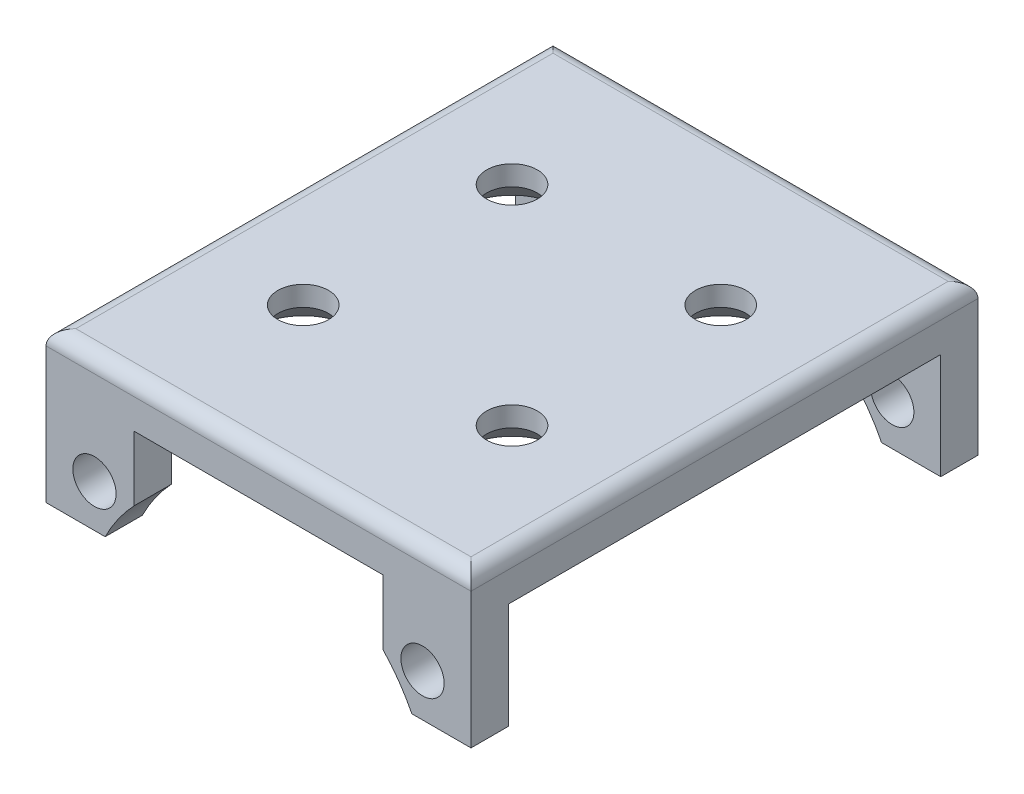
ISO-10303-21;
HEADER;
FILE_DESCRIPTION(('STEP AP214'),'2;1');
FILE_NAME('part.step','',(''),(''),'','','');
FILE_SCHEMA(('AUTOMOTIVE_DESIGN { 1 0 10303 214 1 1 1 1 }'));
ENDSEC;
DATA;
#1=APPLICATION_CONTEXT('core data for automotive mechanical design processes');
#2=APPLICATION_PROTOCOL_DEFINITION('international standard','automotive_design',2000,#1);
#3=PRODUCT_CONTEXT('',#1,'mechanical');
#4=PRODUCT('Part','Part','',(#3));
#5=PRODUCT_RELATED_PRODUCT_CATEGORY('part','',(#4));
#6=PRODUCT_DEFINITION_FORMATION('','',#4);
#7=PRODUCT_DEFINITION_CONTEXT('part definition',#1,'design');
#8=PRODUCT_DEFINITION('design','',#6,#7);
#9=PRODUCT_DEFINITION_SHAPE('','',#8);
#10=(LENGTH_UNIT() NAMED_UNIT(*) SI_UNIT(.MILLI.,.METRE.));
#11=(NAMED_UNIT(*) PLANE_ANGLE_UNIT() SI_UNIT($,.RADIAN.));
#12=(NAMED_UNIT(*) SI_UNIT($,.STERADIAN.) SOLID_ANGLE_UNIT());
#13=UNCERTAINTY_MEASURE_WITH_UNIT(LENGTH_MEASURE(1.E-05),#10,'distance_accuracy_value','');
#14=(GEOMETRIC_REPRESENTATION_CONTEXT(3) GLOBAL_UNCERTAINTY_ASSIGNED_CONTEXT((#13)) GLOBAL_UNIT_ASSIGNED_CONTEXT((#10,
#11,#12)) REPRESENTATION_CONTEXT('',''));
#15=CARTESIAN_POINT('',(0.,0.,0.));
#16=DIRECTION('',(0.,0.,1.));
#17=DIRECTION('',(1.,0.,0.));
#18=AXIS2_PLACEMENT_3D('',#15,#16,#17);
#19=CARTESIAN_POINT('',(0.,0.,-17.));
#20=DIRECTION('',(0.,0.,1.));
#21=DIRECTION('',(1.,0.,0.));
#22=AXIS2_PLACEMENT_3D('',#19,#20,#21);
#23=CYLINDRICAL_SURFACE('',#22,11.5);
#24=CARTESIAN_POINT('',(0.,0.,-17.));
#25=DIRECTION('',(0.,0.,1.));
#26=DIRECTION('',(1.,0.,0.));
#27=AXIS2_PLACEMENT_3D('',#24,#25,#26);
#28=CIRCLE('',#27,11.5);
#29=CARTESIAN_POINT('',(-8.35,7.90743321185831,-17.));
#30=VERTEX_POINT('',#29);
#31=CARTESIAN_POINT('',(-10.2823878549683,5.15,-17.));
#32=VERTEX_POINT('',#31);
#33=EDGE_CURVE('E212',#30,#32,#28,.T.);
#34=ORIENTED_EDGE('',*,*,#33,.F.);
#35=DIRECTION('',(0.,0.,1.));
#36=VECTOR('',#35,1.);
#37=CARTESIAN_POINT('',(-8.35,7.90743321185831,-17.));
#38=LINE('',#37,#36);
#39=CARTESIAN_POINT('',(-8.35,7.90743321185832,-14.5));
#40=VERTEX_POINT('',#39);
#41=EDGE_CURVE('E248',#30,#40,#38,.T.);
#42=ORIENTED_EDGE('',*,*,#41,.T.);
#43=CARTESIAN_POINT('',(0.,0.,-14.5));
#44=DIRECTION('',(0.,0.,-1.));
#45=DIRECTION('',(-1.,0.,0.));
#46=AXIS2_PLACEMENT_3D('',#43,#44,#45);
#47=CIRCLE('',#46,11.5);
#48=CARTESIAN_POINT('',(-10.2823878549683,5.15,-14.5));
#49=VERTEX_POINT('',#48);
#50=EDGE_CURVE('E322',#40,#49,#47,.F.);
#51=ORIENTED_EDGE('',*,*,#50,.T.);
#52=DIRECTION('',(0.,0.,1.));
#53=VECTOR('',#52,1.);
#54=CARTESIAN_POINT('',(-10.2823878549683,5.15,-17.));
#55=LINE('',#54,#53);
#56=EDGE_CURVE('E396',#49,#32,#55,.F.);
#57=ORIENTED_EDGE('',*,*,#56,.T.);
#58=EDGE_LOOP('',(#34,#42,#51,#57));
#59=FACE_BOUND('',#58,.T.);
#60=ADVANCED_FACE('F47',(#59),#23,.F.);
#61=CARTESIAN_POINT('',(-11.,8.,-17.));
#62=DIRECTION('',(0.,0.,1.));
#63=DIRECTION('',(1.,0.,0.));
#64=AXIS2_PLACEMENT_3D('',#61,#62,#63);
#65=CYLINDRICAL_SURFACE('',#64,1.45);
#66=CARTESIAN_POINT('',(-11.,8.,-14.5));
#67=DIRECTION('',(0.,0.,-1.));
#68=DIRECTION('',(-1.,0.,0.));
#69=AXIS2_PLACEMENT_3D('',#66,#67,#68);
#70=CIRCLE('',#69,1.45);
#71=CARTESIAN_POINT('',(-12.45,8.,-14.5));
#72=VERTEX_POINT('',#71);
#73=EDGE_CURVE('E318',#72,#72,#70,.F.);
#74=ORIENTED_EDGE('',*,*,#73,.T.);
#75=EDGE_LOOP('',(#74));
#76=FACE_BOUND('',#75,.T.);
#77=CARTESIAN_POINT('',(-11.,8.,-17.));
#78=DIRECTION('',(0.,0.,1.));
#79=DIRECTION('',(1.,0.,0.));
#80=AXIS2_PLACEMENT_3D('',#77,#78,#79);
#81=CIRCLE('',#80,1.45);
#82=CARTESIAN_POINT('',(-9.55000000000001,8.,-17.));
#83=VERTEX_POINT('',#82);
#84=EDGE_CURVE('E211',#83,#83,#81,.T.);
#85=ORIENTED_EDGE('',*,*,#84,.F.);
#86=EDGE_LOOP('',(#85));
#87=FACE_BOUND('',#86,.T.);
#88=ADVANCED_FACE('F591',(#76,#87),#65,.F.);
#89=CARTESIAN_POINT('',(0.,0.,-17.));
#90=DIRECTION('',(0.,0.,1.));
#91=DIRECTION('',(1.,0.,0.));
#92=AXIS2_PLACEMENT_3D('',#89,#90,#91);
#93=CYLINDRICAL_SURFACE('',#92,11.5);
#94=CARTESIAN_POINT('',(0.,0.,-14.5));
#95=DIRECTION('',(0.,0.,-1.));
#96=DIRECTION('',(-1.,0.,0.));
#97=AXIS2_PLACEMENT_3D('',#94,#95,#96);
#98=CIRCLE('',#97,11.5);
#99=CARTESIAN_POINT('',(10.2823878549683,5.15,-14.5));
#100=VERTEX_POINT('',#99);
#101=CARTESIAN_POINT('',(8.35,7.90743321185832,-14.5));
#102=VERTEX_POINT('',#101);
#103=EDGE_CURVE('E314',#100,#102,#98,.F.);
#104=ORIENTED_EDGE('',*,*,#103,.T.);
#105=DIRECTION('',(0.,0.,1.));
#106=VECTOR('',#105,1.);
#107=CARTESIAN_POINT('',(8.35,7.90743321185831,-17.));
#108=LINE('',#107,#106);
#109=CARTESIAN_POINT('',(8.35,7.90743321185831,-17.));
#110=VERTEX_POINT('',#109);
#111=EDGE_CURVE('E71',#102,#110,#108,.F.);
#112=ORIENTED_EDGE('',*,*,#111,.T.);
#113=CARTESIAN_POINT('',(0.,0.,-17.));
#114=DIRECTION('',(0.,0.,1.));
#115=DIRECTION('',(1.,0.,0.));
#116=AXIS2_PLACEMENT_3D('',#113,#114,#115);
#117=CIRCLE('',#116,11.5);
#118=CARTESIAN_POINT('',(10.2823878549683,5.15,-17.));
#119=VERTEX_POINT('',#118);
#120=EDGE_CURVE('E224',#119,#110,#117,.T.);
#121=ORIENTED_EDGE('',*,*,#120,.F.);
#122=DIRECTION('',(0.,0.,1.));
#123=VECTOR('',#122,1.);
#124=CARTESIAN_POINT('',(10.2823878549683,5.15,-17.));
#125=LINE('',#124,#123);
#126=EDGE_CURVE('E400',#119,#100,#125,.T.);
#127=ORIENTED_EDGE('',*,*,#126,.T.);
#128=EDGE_LOOP('',(#104,#112,#121,#127));
#129=FACE_BOUND('',#128,.T.);
#130=ADVANCED_FACE('F573',(#129),#93,.F.);
#131=CARTESIAN_POINT('',(11.,8.00000000000031,-17.));
#132=DIRECTION('',(0.,0.,1.));
#133=DIRECTION('',(1.,0.,0.));
#134=AXIS2_PLACEMENT_3D('',#131,#132,#133);
#135=CYLINDRICAL_SURFACE('',#134,1.45);
#136=CARTESIAN_POINT('',(11.,8.00000000000031,-14.5));
#137=DIRECTION('',(0.,0.,-1.));
#138=DIRECTION('',(-1.,0.,0.));
#139=AXIS2_PLACEMENT_3D('',#136,#137,#138);
#140=CIRCLE('',#139,1.45);
#141=CARTESIAN_POINT('',(9.54999999999999,8.00000000000031,-14.5));
#142=VERTEX_POINT('',#141);
#143=EDGE_CURVE('E310',#142,#142,#140,.F.);
#144=ORIENTED_EDGE('',*,*,#143,.T.);
#145=EDGE_LOOP('',(#144));
#146=FACE_BOUND('',#145,.T.);
#147=CARTESIAN_POINT('',(11.,8.00000000000031,-17.));
#148=DIRECTION('',(0.,0.,1.));
#149=DIRECTION('',(1.,0.,0.));
#150=AXIS2_PLACEMENT_3D('',#147,#148,#149);
#151=CIRCLE('',#150,1.45);
#152=CARTESIAN_POINT('',(12.45,8.00000000000031,-17.));
#153=VERTEX_POINT('',#152);
#154=EDGE_CURVE('E453',#153,#153,#151,.T.);
#155=ORIENTED_EDGE('',*,*,#154,.F.);
#156=EDGE_LOOP('',(#155));
#157=FACE_BOUND('',#156,.T.);
#158=ADVANCED_FACE('F611',(#146,#157),#135,.F.);
#159=CARTESIAN_POINT('',(0.,12.25,-17.));
#160=DIRECTION('',(0.,-1.,0.));
#161=DIRECTION('',(0.,0.,-1.));
#162=AXIS2_PLACEMENT_3D('',#159,#160,#161);
#163=PLANE('',#162);
#164=DIRECTION('',(0.,0.,1.));
#165=VECTOR('',#164,1.);
#166=CARTESIAN_POINT('',(8.35,12.25,-17.));
#167=LINE('',#166,#165);
#168=CARTESIAN_POINT('',(8.35,12.25,14.5));
#169=VERTEX_POINT('',#168);
#170=CARTESIAN_POINT('',(8.35,12.25,17.));
#171=VERTEX_POINT('',#170);
#172=EDGE_CURVE('E63',#169,#171,#167,.T.);
#173=ORIENTED_EDGE('',*,*,#172,.T.);
#174=DIRECTION('',(1.,0.,0.));
#175=VECTOR('',#174,1.);
#176=CARTESIAN_POINT('',(0.,12.25,17.));
#177=LINE('',#176,#175);
#178=CARTESIAN_POINT('',(-8.35,12.25,17.));
#179=VERTEX_POINT('',#178);
#180=EDGE_CURVE('E429',#179,#171,#177,.T.);
#181=ORIENTED_EDGE('',*,*,#180,.F.);
#182=DIRECTION('',(0.,0.,1.));
#183=VECTOR('',#182,1.);
#184=CARTESIAN_POINT('',(-8.35,12.25,-17.));
#185=LINE('',#184,#183);
#186=CARTESIAN_POINT('',(-8.35,12.25,14.5));
#187=VERTEX_POINT('',#186);
#188=EDGE_CURVE('E217',#187,#179,#185,.T.);
#189=ORIENTED_EDGE('',*,*,#188,.F.);
#190=DIRECTION('',(-1.,0.,0.));
#191=VECTOR('',#190,1.);
#192=CARTESIAN_POINT('',(14.25,12.25,14.5));
#193=LINE('',#192,#191);
#194=CARTESIAN_POINT('',(-14.25,12.25,14.5));
#195=VERTEX_POINT('',#194);
#196=EDGE_CURVE('E286',#187,#195,#193,.T.);
#197=ORIENTED_EDGE('',*,*,#196,.T.);
#198=DIRECTION('',(0.,0.,-1.));
#199=VECTOR('',#198,1.);
#200=CARTESIAN_POINT('',(-14.25,12.25,-14.2));
#201=LINE('',#200,#199);
#202=CARTESIAN_POINT('',(-14.25,12.25,-14.5));
#203=VERTEX_POINT('',#202);
#204=EDGE_CURVE('E412',#195,#203,#201,.T.);
#205=ORIENTED_EDGE('',*,*,#204,.T.);
#206=DIRECTION('',(-1.,0.,0.));
#207=VECTOR('',#206,1.);
#208=CARTESIAN_POINT('',(14.25,12.25,-14.5));
#209=LINE('',#208,#207);
#210=CARTESIAN_POINT('',(-8.35,12.25,-14.5));
#211=VERTEX_POINT('',#210);
#212=EDGE_CURVE('E281',#211,#203,#209,.T.);
#213=ORIENTED_EDGE('',*,*,#212,.F.);
#214=CARTESIAN_POINT('',(-8.35,12.25,-17.));
#215=VERTEX_POINT('',#214);
#216=EDGE_CURVE('E205',#215,#211,#185,.T.);
#217=ORIENTED_EDGE('',*,*,#216,.F.);
#218=DIRECTION('',(1.,0.,0.));
#219=VECTOR('',#218,1.);
#220=CARTESIAN_POINT('',(0.,12.25,-17.));
#221=LINE('',#220,#219);
#222=CARTESIAN_POINT('',(8.35,12.25,-17.));
#223=VERTEX_POINT('',#222);
#224=EDGE_CURVE('E197',#215,#223,#221,.T.);
#225=ORIENTED_EDGE('',*,*,#224,.T.);
#226=CARTESIAN_POINT('',(8.35,12.25,-14.5));
#227=VERTEX_POINT('',#226);
#228=EDGE_CURVE('E202',#223,#227,#167,.T.);
#229=ORIENTED_EDGE('',*,*,#228,.T.);
#230=CARTESIAN_POINT('',(14.25,12.25,-14.5));
#231=VERTEX_POINT('',#230);
#232=EDGE_CURVE('E277',#231,#227,#209,.T.);
#233=ORIENTED_EDGE('',*,*,#232,.F.);
#234=DIRECTION('',(0.,0.,-1.));
#235=VECTOR('',#234,1.);
#236=CARTESIAN_POINT('',(14.25,12.25,-14.2));
#237=LINE('',#236,#235);
#238=CARTESIAN_POINT('',(14.25,12.25,14.5));
#239=VERTEX_POINT('',#238);
#240=EDGE_CURVE('E408',#239,#231,#237,.T.);
#241=ORIENTED_EDGE('',*,*,#240,.F.);
#242=EDGE_CURVE('E282',#239,#169,#193,.T.);
#243=ORIENTED_EDGE('',*,*,#242,.T.);
#244=EDGE_LOOP('',(#173,#181,#189,#197,#205,#213,#217,#225,#229,#233,#241,#243));
#245=FACE_BOUND('',#244,.T.);
#246=CARTESIAN_POINT('',(-7.,12.25,7.));
#247=DIRECTION('',(0.,-1.,0.));
#248=DIRECTION('',(0.,0.,-1.));
#249=AXIS2_PLACEMENT_3D('',#246,#247,#248);
#250=CIRCLE('',#249,3.36);
#251=CARTESIAN_POINT('',(-7.,12.25,3.64));
#252=VERTEX_POINT('',#251);
#253=EDGE_CURVE('E325',#252,#252,#250,.T.);
#254=ORIENTED_EDGE('',*,*,#253,.F.);
#255=EDGE_LOOP('',(#254));
#256=FACE_BOUND('',#255,.T.);
#257=CARTESIAN_POINT('',(-6.99999999999985,12.25,-7.));
#258=DIRECTION('',(0.,-1.,0.));
#259=DIRECTION('',(0.,0.,-1.));
#260=AXIS2_PLACEMENT_3D('',#257,#258,#259);
#261=CIRCLE('',#260,3.36);
#262=CARTESIAN_POINT('',(-6.99999999999985,12.25,-10.36));
#263=VERTEX_POINT('',#262);
#264=EDGE_CURVE('E337',#263,#263,#261,.T.);
#265=ORIENTED_EDGE('',*,*,#264,.F.);
#266=EDGE_LOOP('',(#265));
#267=FACE_BOUND('',#266,.T.);
#268=CARTESIAN_POINT('',(7.00000000000015,12.25,-7.));
#269=DIRECTION('',(0.,-1.,0.));
#270=DIRECTION('',(0.,0.,-1.));
#271=AXIS2_PLACEMENT_3D('',#268,#269,#270);
#272=CIRCLE('',#271,3.36);
#273=CARTESIAN_POINT('',(7.00000000000015,12.25,-10.36));
#274=VERTEX_POINT('',#273);
#275=EDGE_CURVE('E349',#274,#274,#272,.T.);
#276=ORIENTED_EDGE('',*,*,#275,.F.);
#277=EDGE_LOOP('',(#276));
#278=FACE_BOUND('',#277,.T.);
#279=CARTESIAN_POINT('',(7.,12.25,7.));
#280=DIRECTION('',(0.,-1.,0.));
#281=DIRECTION('',(0.,0.,-1.));
#282=AXIS2_PLACEMENT_3D('',#279,#280,#281);
#283=CIRCLE('',#282,3.36);
#284=CARTESIAN_POINT('',(7.,12.25,3.64));
#285=VERTEX_POINT('',#284);
#286=EDGE_CURVE('E361',#285,#285,#283,.T.);
#287=ORIENTED_EDGE('',*,*,#286,.F.);
#288=EDGE_LOOP('',(#287));
#289=FACE_BOUND('',#288,.T.);
#290=ADVANCED_FACE('F199',(#245,#256,#267,#278,#289),#163,.T.);
#291=CARTESIAN_POINT('',(0.,0.,14.5));
#292=DIRECTION('',(0.,0.,1.));
#293=DIRECTION('',(1.,0.,0.));
#294=AXIS2_PLACEMENT_3D('',#291,#292,#293);
#295=CIRCLE('',#294,11.5);
#296=CARTESIAN_POINT('',(-10.2823878549683,5.15,14.5));
#297=VERTEX_POINT('',#296);
#298=CARTESIAN_POINT('',(-8.35,7.90743321185832,14.5));
#299=VERTEX_POINT('',#298);
#300=EDGE_CURVE('E306',#297,#299,#295,.F.);
#301=ORIENTED_EDGE('',*,*,#300,.T.);
#302=DIRECTION('',(0.,0.,1.));
#303=VECTOR('',#302,1.);
#304=CARTESIAN_POINT('',(-8.35,7.90743321185831,-17.));
#305=LINE('',#304,#303);
#306=CARTESIAN_POINT('',(-8.35,7.90743321185831,17.));
#307=VERTEX_POINT('',#306);
#308=EDGE_CURVE('E239',#299,#307,#305,.T.);
#309=ORIENTED_EDGE('',*,*,#308,.T.);
#310=CARTESIAN_POINT('',(0.,0.,17.));
#311=DIRECTION('',(0.,0.,1.));
#312=DIRECTION('',(1.,0.,0.));
#313=AXIS2_PLACEMENT_3D('',#310,#311,#312);
#314=CIRCLE('',#313,11.5);
#315=CARTESIAN_POINT('',(-10.2823878549683,5.15,17.));
#316=VERTEX_POINT('',#315);
#317=EDGE_CURVE('E426',#307,#316,#314,.T.);
#318=ORIENTED_EDGE('',*,*,#317,.T.);
#319=DIRECTION('',(0.,0.,1.));
#320=VECTOR('',#319,1.);
#321=CARTESIAN_POINT('',(-10.2823878549683,5.15,-17.));
#322=LINE('',#321,#320);
#323=EDGE_CURVE('E387',#316,#297,#322,.F.);
#324=ORIENTED_EDGE('',*,*,#323,.T.);
#325=EDGE_LOOP('',(#301,#309,#318,#324));
#326=FACE_BOUND('',#325,.T.);
#327=ADVANCED_FACE('F509',(#326),#23,.F.);
#328=CARTESIAN_POINT('',(-14.25,0.,-17.));
#329=DIRECTION('',(1.,0.,0.));
#330=DIRECTION('',(0.,1.,0.));
#331=AXIS2_PLACEMENT_3D('',#328,#329,#330);
#332=PLANE('',#331);
#333=DIRECTION('',(0.,0.,1.));
#334=VECTOR('',#333,1.);
#335=CARTESIAN_POINT('',(-14.25,5.15,-17.));
#336=LINE('',#335,#334);
#337=CARTESIAN_POINT('',(-14.25,5.15,-17.));
#338=VERTEX_POINT('',#337);
#339=CARTESIAN_POINT('',(-14.25,5.15,-14.5));
#340=VERTEX_POINT('',#339);
#341=EDGE_CURVE('E383',#338,#340,#336,.T.);
#342=ORIENTED_EDGE('',*,*,#341,.T.);
#343=DIRECTION('',(0.,-1.,0.));
#344=VECTOR('',#343,1.);
#345=CARTESIAN_POINT('',(-14.25,5.15,-14.5));
#346=LINE('',#345,#344);
#347=EDGE_CURVE('E261',#203,#340,#346,.T.);
#348=ORIENTED_EDGE('',*,*,#347,.F.);
#349=ORIENTED_EDGE('',*,*,#204,.F.);
#350=DIRECTION('',(0.,1.,0.));
#351=VECTOR('',#350,1.);
#352=CARTESIAN_POINT('',(-14.25,5.15,14.5));
#353=LINE('',#352,#351);
#354=CARTESIAN_POINT('',(-14.25,5.15,14.5));
#355=VERTEX_POINT('',#354);
#356=EDGE_CURVE('E267',#355,#195,#353,.T.);
#357=ORIENTED_EDGE('',*,*,#356,.F.);
#358=CARTESIAN_POINT('',(-14.25,5.15,17.));
#359=VERTEX_POINT('',#358);
#360=EDGE_CURVE('E388',#355,#359,#336,.T.);
#361=ORIENTED_EDGE('',*,*,#360,.T.);
#362=DIRECTION('',(0.,1.,0.));
#363=VECTOR('',#362,1.);
#364=CARTESIAN_POINT('',(-14.25,0.,17.));
#365=LINE('',#364,#363);
#366=CARTESIAN_POINT('',(-14.25,14.25,17.));
#367=VERTEX_POINT('',#366);
#368=EDGE_CURVE('E423',#359,#367,#365,.T.);
#369=ORIENTED_EDGE('',*,*,#368,.T.);
#370=DIRECTION('',(0.,0.,1.));
#371=VECTOR('',#370,1.);
#372=CARTESIAN_POINT('',(-14.25,14.25,-17.));
#373=LINE('',#372,#371);
#374=CARTESIAN_POINT('',(-14.25,14.25,-17.));
#375=VERTEX_POINT('',#374);
#376=EDGE_CURVE('E474',#367,#375,#373,.F.);
#377=ORIENTED_EDGE('',*,*,#376,.T.);
#378=DIRECTION('',(0.,1.,0.));
#379=VECTOR('',#378,1.);
#380=CARTESIAN_POINT('',(-14.25,0.,-17.));
#381=LINE('',#380,#379);
#382=EDGE_CURVE('E445',#338,#375,#381,.T.);
#383=ORIENTED_EDGE('',*,*,#382,.F.);
#384=EDGE_LOOP('',(#342,#348,#349,#357,#361,#369,#377,#383));
#385=FACE_BOUND('',#384,.T.);
#386=ADVANCED_FACE('F554',(#385),#332,.F.);
#387=CARTESIAN_POINT('',(0.,15.25,-17.));
#388=DIRECTION('',(0.,1.,0.));
#389=DIRECTION('',(0.,0.,1.));
#390=AXIS2_PLACEMENT_3D('',#387,#388,#389);
#391=PLANE('',#390);
#392=CARTESIAN_POINT('',(-7.,15.25,7.));
#393=DIRECTION('',(0.,-1.,0.));
#394=DIRECTION('',(0.,0.,-1.));
#395=AXIS2_PLACEMENT_3D('',#392,#393,#394);
#396=CIRCLE('',#395,1.69999999999999);
#397=CARTESIAN_POINT('',(-7.,15.25,5.30000000000001));
#398=VERTEX_POINT('',#397);
#399=EDGE_CURVE('E333',#398,#398,#396,.T.);
#400=ORIENTED_EDGE('',*,*,#399,.T.);
#401=EDGE_LOOP('',(#400));
#402=FACE_BOUND('',#401,.T.);
#403=CARTESIAN_POINT('',(-6.99999999999985,15.25,-7.));
#404=DIRECTION('',(0.,-1.,0.));
#405=DIRECTION('',(0.,0.,-1.));
#406=AXIS2_PLACEMENT_3D('',#403,#404,#405);
#407=CIRCLE('',#406,1.69999999999999);
#408=CARTESIAN_POINT('',(-6.99999999999985,15.25,-8.69999999999999));
#409=VERTEX_POINT('',#408);
#410=EDGE_CURVE('E345',#409,#409,#407,.T.);
#411=ORIENTED_EDGE('',*,*,#410,.T.);
#412=EDGE_LOOP('',(#411));
#413=FACE_BOUND('',#412,.T.);
#414=CARTESIAN_POINT('',(7.00000000000015,15.25,-7.));
#415=DIRECTION('',(0.,-1.,0.));
#416=DIRECTION('',(0.,0.,-1.));
#417=AXIS2_PLACEMENT_3D('',#414,#415,#416);
#418=CIRCLE('',#417,1.69999999999999);
#419=CARTESIAN_POINT('',(7.00000000000015,15.25,-8.69999999999999));
#420=VERTEX_POINT('',#419);
#421=EDGE_CURVE('E357',#420,#420,#418,.T.);
#422=ORIENTED_EDGE('',*,*,#421,.T.);
#423=EDGE_LOOP('',(#422));
#424=FACE_BOUND('',#423,.T.);
#425=CARTESIAN_POINT('',(7.,15.25,7.));
#426=DIRECTION('',(0.,-1.,0.));
#427=DIRECTION('',(0.,0.,-1.));
#428=AXIS2_PLACEMENT_3D('',#425,#426,#427);
#429=CIRCLE('',#428,1.69999999999999);
#430=CARTESIAN_POINT('',(7.,15.25,5.30000000000001));
#431=VERTEX_POINT('',#430);
#432=EDGE_CURVE('E369',#431,#431,#429,.T.);
#433=ORIENTED_EDGE('',*,*,#432,.T.);
#434=EDGE_LOOP('',(#433));
#435=FACE_BOUND('',#434,.T.);
#436=DIRECTION('',(0.,0.,1.));
#437=VECTOR('',#436,1.);
#438=CARTESIAN_POINT('',(13.25,15.25,-17.));
#439=LINE('',#438,#437);
#440=CARTESIAN_POINT('',(13.25,15.25,16.));
#441=VERTEX_POINT('',#440);
#442=CARTESIAN_POINT('',(13.25,15.25,-16.));
#443=VERTEX_POINT('',#442);
#444=EDGE_CURVE('E467',#441,#443,#439,.F.);
#445=ORIENTED_EDGE('',*,*,#444,.T.);
#446=DIRECTION('',(-1.,0.,0.));
#447=VECTOR('',#446,1.);
#448=CARTESIAN_POINT('',(-14.25,15.25,-16.));
#449=LINE('',#448,#447);
#450=CARTESIAN_POINT('',(-13.25,15.25,-16.));
#451=VERTEX_POINT('',#450);
#452=EDGE_CURVE('E471',#443,#451,#449,.T.);
#453=ORIENTED_EDGE('',*,*,#452,.T.);
#454=DIRECTION('',(0.,0.,1.));
#455=VECTOR('',#454,1.);
#456=CARTESIAN_POINT('',(-13.25,15.25,17.));
#457=LINE('',#456,#455);
#458=CARTESIAN_POINT('',(-13.25,15.25,16.));
#459=VERTEX_POINT('',#458);
#460=EDGE_CURVE('E464',#451,#459,#457,.T.);
#461=ORIENTED_EDGE('',*,*,#460,.T.);
#462=DIRECTION('',(-1.,0.,0.));
#463=VECTOR('',#462,1.);
#464=CARTESIAN_POINT('',(0.,15.25,16.));
#465=LINE('',#464,#463);
#466=EDGE_CURVE('E461',#459,#441,#465,.F.);
#467=ORIENTED_EDGE('',*,*,#466,.T.);
#468=EDGE_LOOP('',(#445,#453,#461,#467));
#469=FACE_BOUND('',#468,.T.);
#470=ADVANCED_FACE('F610',(#402,#413,#424,#435,#469),#391,.T.);
#471=CARTESIAN_POINT('',(14.25,0.,-17.));
#472=DIRECTION('',(1.,0.,0.));
#473=DIRECTION('',(0.,1.,0.));
#474=AXIS2_PLACEMENT_3D('',#471,#472,#473);
#475=PLANE('',#474);
#476=DIRECTION('',(0.,-1.,0.));
#477=VECTOR('',#476,1.);
#478=CARTESIAN_POINT('',(14.25,5.14999999999999,-14.5));
#479=LINE('',#478,#477);
#480=CARTESIAN_POINT('',(14.25,5.14999999999999,-14.5));
#481=VERTEX_POINT('',#480);
#482=EDGE_CURVE('E262',#231,#481,#479,.T.);
#483=ORIENTED_EDGE('',*,*,#482,.T.);
#484=DIRECTION('',(0.,0.,1.));
#485=VECTOR('',#484,1.);
#486=CARTESIAN_POINT('',(14.25,5.15,-17.));
#487=LINE('',#486,#485);
#488=CARTESIAN_POINT('',(14.25,5.15,-17.));
#489=VERTEX_POINT('',#488);
#490=EDGE_CURVE('E389',#489,#481,#487,.T.);
#491=ORIENTED_EDGE('',*,*,#490,.F.);
#492=DIRECTION('',(0.,1.,0.));
#493=VECTOR('',#492,1.);
#494=CARTESIAN_POINT('',(14.25,0.,-17.));
#495=LINE('',#494,#493);
#496=CARTESIAN_POINT('',(14.25,14.25,-17.));
#497=VERTEX_POINT('',#496);
#498=EDGE_CURVE('E442',#489,#497,#495,.T.);
#499=ORIENTED_EDGE('',*,*,#498,.T.);
#500=DIRECTION('',(0.,0.,1.));
#501=VECTOR('',#500,1.);
#502=CARTESIAN_POINT('',(14.25,14.25,-17.));
#503=LINE('',#502,#501);
#504=CARTESIAN_POINT('',(14.25,14.25,17.));
#505=VERTEX_POINT('',#504);
#506=EDGE_CURVE('E457',#497,#505,#503,.T.);
#507=ORIENTED_EDGE('',*,*,#506,.T.);
#508=DIRECTION('',(0.,1.,0.));
#509=VECTOR('',#508,1.);
#510=CARTESIAN_POINT('',(14.25,0.,17.));
#511=LINE('',#510,#509);
#512=CARTESIAN_POINT('',(14.25,5.15,17.));
#513=VERTEX_POINT('',#512);
#514=EDGE_CURVE('E420',#513,#505,#511,.T.);
#515=ORIENTED_EDGE('',*,*,#514,.F.);
#516=CARTESIAN_POINT('',(14.25,5.15,14.5));
#517=VERTEX_POINT('',#516);
#518=EDGE_CURVE('E377',#517,#513,#487,.T.);
#519=ORIENTED_EDGE('',*,*,#518,.F.);
#520=DIRECTION('',(0.,1.,0.));
#521=VECTOR('',#520,1.);
#522=CARTESIAN_POINT('',(14.25,5.14999999999999,14.5));
#523=LINE('',#522,#521);
#524=EDGE_CURVE('E266',#517,#239,#523,.T.);
#525=ORIENTED_EDGE('',*,*,#524,.T.);
#526=ORIENTED_EDGE('',*,*,#240,.T.);
#527=EDGE_LOOP('',(#483,#491,#499,#507,#515,#519,#525,#526));
#528=FACE_BOUND('',#527,.T.);
#529=ADVANCED_FACE('F541',(#528),#475,.T.);
#530=CARTESIAN_POINT('',(-11.,8.,14.5));
#531=DIRECTION('',(0.,0.,1.));
#532=DIRECTION('',(1.,0.,0.));
#533=AXIS2_PLACEMENT_3D('',#530,#531,#532);
#534=CIRCLE('',#533,1.45);
#535=CARTESIAN_POINT('',(-9.55000000000001,8.,14.5));
#536=VERTEX_POINT('',#535);
#537=EDGE_CURVE('E302',#536,#536,#534,.F.);
#538=ORIENTED_EDGE('',*,*,#537,.T.);
#539=EDGE_LOOP('',(#538));
#540=FACE_BOUND('',#539,.T.);
#541=CARTESIAN_POINT('',(-11.,8.,17.));
#542=DIRECTION('',(0.,0.,1.));
#543=DIRECTION('',(1.,0.,0.));
#544=AXIS2_PLACEMENT_3D('',#541,#542,#543);
#545=CIRCLE('',#544,1.45);
#546=CARTESIAN_POINT('',(-9.55000000000001,8.,17.));
#547=VERTEX_POINT('',#546);
#548=EDGE_CURVE('E432',#547,#547,#545,.T.);
#549=ORIENTED_EDGE('',*,*,#548,.T.);
#550=EDGE_LOOP('',(#549));
#551=FACE_BOUND('',#550,.T.);
#552=ADVANCED_FACE('F601',(#540,#551),#65,.F.);
#553=CARTESIAN_POINT('',(0.,0.,17.));
#554=DIRECTION('',(0.,0.,1.));
#555=DIRECTION('',(1.,0.,0.));
#556=AXIS2_PLACEMENT_3D('',#553,#554,#555);
#557=CIRCLE('',#556,11.5);
#558=CARTESIAN_POINT('',(10.2823878549683,5.15,17.));
#559=VERTEX_POINT('',#558);
#560=CARTESIAN_POINT('',(8.35,7.90743321185831,17.));
#561=VERTEX_POINT('',#560);
#562=EDGE_CURVE('E411',#559,#561,#557,.T.);
#563=ORIENTED_EDGE('',*,*,#562,.T.);
#564=DIRECTION('',(0.,0.,1.));
#565=VECTOR('',#564,1.);
#566=CARTESIAN_POINT('',(8.35,7.90743321185831,-17.));
#567=LINE('',#566,#565);
#568=CARTESIAN_POINT('',(8.35,7.90743321185832,14.5));
#569=VERTEX_POINT('',#568);
#570=EDGE_CURVE('E257',#561,#569,#567,.F.);
#571=ORIENTED_EDGE('',*,*,#570,.T.);
#572=CARTESIAN_POINT('',(0.,0.,14.5));
#573=DIRECTION('',(0.,0.,1.));
#574=DIRECTION('',(1.,0.,0.));
#575=AXIS2_PLACEMENT_3D('',#572,#573,#574);
#576=CIRCLE('',#575,11.5);
#577=CARTESIAN_POINT('',(10.2823878549683,5.14999999999999,14.5));
#578=VERTEX_POINT('',#577);
#579=EDGE_CURVE('E299',#569,#578,#576,.F.);
#580=ORIENTED_EDGE('',*,*,#579,.T.);
#581=DIRECTION('',(0.,0.,1.));
#582=VECTOR('',#581,1.);
#583=CARTESIAN_POINT('',(10.2823878549683,5.15,-17.));
#584=LINE('',#583,#582);
#585=EDGE_CURVE('E404',#578,#559,#584,.T.);
#586=ORIENTED_EDGE('',*,*,#585,.T.);
#587=EDGE_LOOP('',(#563,#571,#580,#586));
#588=FACE_BOUND('',#587,.T.);
#589=ADVANCED_FACE('F619',(#588),#93,.F.);
#590=CARTESIAN_POINT('',(11.,8.00000000000031,14.5));
#591=DIRECTION('',(0.,0.,1.));
#592=DIRECTION('',(1.,0.,0.));
#593=AXIS2_PLACEMENT_3D('',#590,#591,#592);
#594=CIRCLE('',#593,1.45);
#595=CARTESIAN_POINT('',(12.45,8.00000000000031,14.5));
#596=VERTEX_POINT('',#595);
#597=EDGE_CURVE('E280',#596,#596,#594,.F.);
#598=ORIENTED_EDGE('',*,*,#597,.T.);
#599=EDGE_LOOP('',(#598));
#600=FACE_BOUND('',#599,.T.);
#601=CARTESIAN_POINT('',(11.,8.00000000000031,17.));
#602=DIRECTION('',(0.,0.,1.));
#603=DIRECTION('',(1.,0.,0.));
#604=AXIS2_PLACEMENT_3D('',#601,#602,#603);
#605=CIRCLE('',#604,1.45);
#606=CARTESIAN_POINT('',(12.45,8.00000000000031,17.));
#607=VERTEX_POINT('',#606);
#608=EDGE_CURVE('E436',#607,#607,#605,.T.);
#609=ORIENTED_EDGE('',*,*,#608,.T.);
#610=EDGE_LOOP('',(#609));
#611=FACE_BOUND('',#610,.T.);
#612=ADVANCED_FACE('F617',(#600,#611),#135,.F.);
#613=CARTESIAN_POINT('',(0.,0.,-17.));
#614=DIRECTION('',(0.,0.,1.));
#615=DIRECTION('',(1.,0.,0.));
#616=AXIS2_PLACEMENT_3D('',#613,#614,#615);
#617=PLANE('',#616);
#618=ORIENTED_EDGE('',*,*,#224,.F.);
#619=DIRECTION('',(0.,-1.,0.));
#620=VECTOR('',#619,1.);
#621=CARTESIAN_POINT('',(-8.35,12.25,-17.));
#622=LINE('',#621,#620);
#623=EDGE_CURVE('E226',#215,#30,#622,.T.);
#624=ORIENTED_EDGE('',*,*,#623,.T.);
#625=ORIENTED_EDGE('',*,*,#33,.T.);
#626=DIRECTION('',(-1.,0.,0.));
#627=VECTOR('',#626,1.);
#628=CARTESIAN_POINT('',(-14.25,5.15,-17.));
#629=LINE('',#628,#627);
#630=EDGE_CURVE('E378',#32,#338,#629,.T.);
#631=ORIENTED_EDGE('',*,*,#630,.T.);
#632=ORIENTED_EDGE('',*,*,#382,.T.);
#633=DIRECTION('',(-1.,0.,0.));
#634=VECTOR('',#633,1.);
#635=CARTESIAN_POINT('',(14.25,14.25,-17.));
#636=LINE('',#635,#634);
#637=EDGE_CURVE('E478',#375,#497,#636,.F.);
#638=ORIENTED_EDGE('',*,*,#637,.T.);
#639=ORIENTED_EDGE('',*,*,#498,.F.);
#640=EDGE_CURVE('E374',#489,#119,#629,.T.);
#641=ORIENTED_EDGE('',*,*,#640,.T.);
#642=ORIENTED_EDGE('',*,*,#120,.T.);
#643=DIRECTION('',(0.,1.,0.));
#644=VECTOR('',#643,1.);
#645=CARTESIAN_POINT('',(8.35,12.25,-17.));
#646=LINE('',#645,#644);
#647=EDGE_CURVE('E215',#110,#223,#646,.T.);
#648=ORIENTED_EDGE('',*,*,#647,.T.);
#649=EDGE_LOOP('',(#618,#624,#625,#631,#632,#638,#639,#641,#642,#648));
#650=FACE_BOUND('',#649,.T.);
#651=ORIENTED_EDGE('',*,*,#84,.T.);
#652=EDGE_LOOP('',(#651));
#653=FACE_BOUND('',#652,.T.);
#654=ORIENTED_EDGE('',*,*,#154,.T.);
#655=EDGE_LOOP('',(#654));
#656=FACE_BOUND('',#655,.T.);
#657=ADVANCED_FACE('F220',(#650,#653,#656),#617,.F.);
#658=CARTESIAN_POINT('',(0.,0.,17.));
#659=DIRECTION('',(0.,0.,1.));
#660=DIRECTION('',(1.,0.,0.));
#661=AXIS2_PLACEMENT_3D('',#658,#659,#660);
#662=PLANE('',#661);
#663=DIRECTION('',(0.,-1.,0.));
#664=VECTOR('',#663,1.);
#665=CARTESIAN_POINT('',(-8.35,12.25,17.));
#666=LINE('',#665,#664);
#667=EDGE_CURVE('E233',#179,#307,#666,.T.);
#668=ORIENTED_EDGE('',*,*,#667,.F.);
#669=ORIENTED_EDGE('',*,*,#180,.T.);
#670=DIRECTION('',(0.,1.,0.));
#671=VECTOR('',#670,1.);
#672=CARTESIAN_POINT('',(8.35,12.25,17.));
#673=LINE('',#672,#671);
#674=EDGE_CURVE('E230',#561,#171,#673,.T.);
#675=ORIENTED_EDGE('',*,*,#674,.F.);
#676=ORIENTED_EDGE('',*,*,#562,.F.);
#677=DIRECTION('',(-1.,0.,0.));
#678=VECTOR('',#677,1.);
#679=CARTESIAN_POINT('',(-14.25,5.15,17.));
#680=LINE('',#679,#678);
#681=EDGE_CURVE('E379',#513,#559,#680,.T.);
#682=ORIENTED_EDGE('',*,*,#681,.F.);
#683=ORIENTED_EDGE('',*,*,#514,.T.);
#684=DIRECTION('',(-1.,0.,0.));
#685=VECTOR('',#684,1.);
#686=CARTESIAN_POINT('',(0.,14.25,17.));
#687=LINE('',#686,#685);
#688=EDGE_CURVE('E482',#505,#367,#687,.T.);
#689=ORIENTED_EDGE('',*,*,#688,.T.);
#690=ORIENTED_EDGE('',*,*,#368,.F.);
#691=EDGE_CURVE('E373',#316,#359,#680,.T.);
#692=ORIENTED_EDGE('',*,*,#691,.F.);
#693=ORIENTED_EDGE('',*,*,#317,.F.);
#694=EDGE_LOOP('',(#668,#669,#675,#676,#682,#683,#689,#690,#692,#693));
#695=FACE_BOUND('',#694,.T.);
#696=ORIENTED_EDGE('',*,*,#548,.F.);
#697=EDGE_LOOP('',(#696));
#698=FACE_BOUND('',#697,.T.);
#699=ORIENTED_EDGE('',*,*,#608,.F.);
#700=EDGE_LOOP('',(#699));
#701=FACE_BOUND('',#700,.T.);
#702=ADVANCED_FACE('F520',(#695,#698,#701),#662,.T.);
#703=CARTESIAN_POINT('',(-13.25,14.25,-17.));
#704=DIRECTION('',(0.,0.,-1.));
#705=DIRECTION('',(-1.,0.,0.));
#706=AXIS2_PLACEMENT_3D('',#703,#704,#705);
#707=CYLINDRICAL_SURFACE('',#706,1.);
#708=CARTESIAN_POINT('',(-13.25,14.25,16.));
#709=DIRECTION('',(-0.707106781186547,0.,-0.707106781186547));
#710=DIRECTION('',(-0.707106781186547,0.,0.707106781186547));
#711=AXIS2_PLACEMENT_3D('',#708,#709,#710);
#712=ELLIPSE('',#711,1.41421356237309,1.);
#713=EDGE_CURVE('E492',#459,#367,#712,.F.);
#714=ORIENTED_EDGE('',*,*,#713,.F.);
#715=ORIENTED_EDGE('',*,*,#460,.F.);
#716=CARTESIAN_POINT('',(-13.25,14.25,-16.));
#717=DIRECTION('',(0.707106781186547,0.,-0.707106781186547));
#718=DIRECTION('',(0.707106781186547,0.,0.707106781186547));
#719=AXIS2_PLACEMENT_3D('',#716,#717,#718);
#720=ELLIPSE('',#719,1.41421356237309,1.);
#721=EDGE_CURVE('E416',#375,#451,#720,.T.);
#722=ORIENTED_EDGE('',*,*,#721,.F.);
#723=ORIENTED_EDGE('',*,*,#376,.F.);
#724=EDGE_LOOP('',(#714,#715,#722,#723));
#725=FACE_BOUND('',#724,.T.);
#726=ADVANCED_FACE('F49',(#725),#707,.T.);
#727=CARTESIAN_POINT('',(0.,14.25,-16.));
#728=DIRECTION('',(1.,0.,0.));
#729=DIRECTION('',(0.,0.,-1.));
#730=AXIS2_PLACEMENT_3D('',#727,#728,#729);
#731=CYLINDRICAL_SURFACE('',#730,1.);
#732=ORIENTED_EDGE('',*,*,#721,.T.);
#733=ORIENTED_EDGE('',*,*,#452,.F.);
#734=CARTESIAN_POINT('',(13.25,14.25,-16.));
#735=DIRECTION('',(0.707106781186547,0.,0.707106781186547));
#736=DIRECTION('',(0.707106781186547,0.,-0.707106781186547));
#737=AXIS2_PLACEMENT_3D('',#734,#735,#736);
#738=ELLIPSE('',#737,1.41421356237309,1.);
#739=EDGE_CURVE('E489',#497,#443,#738,.T.);
#740=ORIENTED_EDGE('',*,*,#739,.F.);
#741=ORIENTED_EDGE('',*,*,#637,.F.);
#742=EDGE_LOOP('',(#732,#733,#740,#741));
#743=FACE_BOUND('',#742,.T.);
#744=ADVANCED_FACE('F565',(#743),#731,.T.);
#745=CARTESIAN_POINT('',(0.,14.25,16.));
#746=DIRECTION('',(-1.,0.,0.));
#747=DIRECTION('',(0.,0.,1.));
#748=AXIS2_PLACEMENT_3D('',#745,#746,#747);
#749=CYLINDRICAL_SURFACE('',#748,1.);
#750=ORIENTED_EDGE('',*,*,#713,.T.);
#751=ORIENTED_EDGE('',*,*,#688,.F.);
#752=CARTESIAN_POINT('',(13.25,14.25,16.));
#753=DIRECTION('',(-0.707106781186547,0.,0.707106781186547));
#754=DIRECTION('',(-0.707106781186547,0.,-0.707106781186547));
#755=AXIS2_PLACEMENT_3D('',#752,#753,#754);
#756=ELLIPSE('',#755,1.41421356237309,1.);
#757=EDGE_CURVE('E407',#441,#505,#756,.F.);
#758=ORIENTED_EDGE('',*,*,#757,.F.);
#759=ORIENTED_EDGE('',*,*,#466,.F.);
#760=EDGE_LOOP('',(#750,#751,#758,#759));
#761=FACE_BOUND('',#760,.T.);
#762=ADVANCED_FACE('F763',(#761),#749,.T.);
#763=CARTESIAN_POINT('',(13.25,14.25,-17.));
#764=DIRECTION('',(0.,0.,1.));
#765=DIRECTION('',(1.,0.,0.));
#766=AXIS2_PLACEMENT_3D('',#763,#764,#765);
#767=CYLINDRICAL_SURFACE('',#766,1.);
#768=ORIENTED_EDGE('',*,*,#739,.T.);
#769=ORIENTED_EDGE('',*,*,#444,.F.);
#770=ORIENTED_EDGE('',*,*,#757,.T.);
#771=ORIENTED_EDGE('',*,*,#506,.F.);
#772=EDGE_LOOP('',(#768,#769,#770,#771));
#773=FACE_BOUND('',#772,.T.);
#774=ADVANCED_FACE('F759',(#773),#767,.T.);
#775=CARTESIAN_POINT('',(-14.25,5.15,-17.));
#776=DIRECTION('',(0.,1.,0.));
#777=DIRECTION('',(0.,0.,1.));
#778=AXIS2_PLACEMENT_3D('',#775,#776,#777);
#779=PLANE('',#778);
#780=ORIENTED_EDGE('',*,*,#360,.F.);
#781=DIRECTION('',(-1.,0.,0.));
#782=VECTOR('',#781,1.);
#783=CARTESIAN_POINT('',(14.25,5.14999999999999,14.5));
#784=LINE('',#783,#782);
#785=EDGE_CURVE('E291',#297,#355,#784,.T.);
#786=ORIENTED_EDGE('',*,*,#785,.F.);
#787=ORIENTED_EDGE('',*,*,#323,.F.);
#788=ORIENTED_EDGE('',*,*,#691,.T.);
#789=EDGE_LOOP('',(#780,#786,#787,#788));
#790=FACE_BOUND('',#789,.T.);
#791=ADVANCED_FACE('F516',(#790),#779,.F.);
#792=ORIENTED_EDGE('',*,*,#56,.F.);
#793=DIRECTION('',(-1.,0.,0.));
#794=VECTOR('',#793,1.);
#795=CARTESIAN_POINT('',(14.25,5.14999999999999,-14.5));
#796=LINE('',#795,#794);
#797=EDGE_CURVE('E271',#49,#340,#796,.T.);
#798=ORIENTED_EDGE('',*,*,#797,.T.);
#799=ORIENTED_EDGE('',*,*,#341,.F.);
#800=ORIENTED_EDGE('',*,*,#630,.F.);
#801=EDGE_LOOP('',(#792,#798,#799,#800));
#802=FACE_BOUND('',#801,.T.);
#803=ADVANCED_FACE('F744',(#802),#779,.F.);
#804=ORIENTED_EDGE('',*,*,#490,.T.);
#805=EDGE_CURVE('E292',#481,#100,#796,.T.);
#806=ORIENTED_EDGE('',*,*,#805,.T.);
#807=ORIENTED_EDGE('',*,*,#126,.F.);
#808=ORIENTED_EDGE('',*,*,#640,.F.);
#809=EDGE_LOOP('',(#804,#806,#807,#808));
#810=FACE_BOUND('',#809,.T.);
#811=ADVANCED_FACE('F571',(#810),#779,.F.);
#812=ORIENTED_EDGE('',*,*,#585,.F.);
#813=EDGE_CURVE('E287',#517,#578,#784,.T.);
#814=ORIENTED_EDGE('',*,*,#813,.F.);
#815=ORIENTED_EDGE('',*,*,#518,.T.);
#816=ORIENTED_EDGE('',*,*,#681,.T.);
#817=EDGE_LOOP('',(#812,#814,#815,#816));
#818=FACE_BOUND('',#817,.T.);
#819=ADVANCED_FACE('F628',(#818),#779,.F.);
#820=CARTESIAN_POINT('',(7.,12.25,7.));
#821=DIRECTION('',(0.,-1.,0.));
#822=DIRECTION('',(0.,0.,-1.));
#823=AXIS2_PLACEMENT_3D('',#820,#821,#822);
#824=CYLINDRICAL_SURFACE('',#823,1.69999999999999);
#825=ORIENTED_EDGE('',*,*,#432,.F.);
#826=EDGE_LOOP('',(#825));
#827=FACE_BOUND('',#826,.T.);
#828=CARTESIAN_POINT('',(7.,13.91,7.));
#829=DIRECTION('',(0.,-1.,0.));
#830=DIRECTION('',(0.,0.,-1.));
#831=AXIS2_PLACEMENT_3D('',#828,#829,#830);
#832=CIRCLE('',#831,1.7);
#833=CARTESIAN_POINT('',(7.,13.91,5.3));
#834=VERTEX_POINT('',#833);
#835=EDGE_CURVE('E365',#834,#834,#832,.T.);
#836=ORIENTED_EDGE('',*,*,#835,.T.);
#837=EDGE_LOOP('',(#836));
#838=FACE_BOUND('',#837,.T.);
#839=ADVANCED_FACE('F630',(#827,#838),#824,.F.);
#840=CARTESIAN_POINT('',(7.,12.25,7.));
#841=DIRECTION('',(0.,-1.,0.));
#842=DIRECTION('',(0.,0.,-1.));
#843=AXIS2_PLACEMENT_3D('',#840,#841,#842);
#844=CONICAL_SURFACE('',#843,3.36,0.785398163397448);
#845=ORIENTED_EDGE('',*,*,#835,.F.);
#846=EDGE_LOOP('',(#845));
#847=FACE_BOUND('',#846,.T.);
#848=ORIENTED_EDGE('',*,*,#286,.T.);
#849=EDGE_LOOP('',(#848));
#850=FACE_BOUND('',#849,.T.);
#851=ADVANCED_FACE('F633',(#847,#850),#844,.F.);
#852=CARTESIAN_POINT('',(7.00000000000015,12.25,-7.));
#853=DIRECTION('',(0.,-1.,0.));
#854=DIRECTION('',(0.,0.,-1.));
#855=AXIS2_PLACEMENT_3D('',#852,#853,#854);
#856=CYLINDRICAL_SURFACE('',#855,1.69999999999999);
#857=ORIENTED_EDGE('',*,*,#421,.F.);
#858=EDGE_LOOP('',(#857));
#859=FACE_BOUND('',#858,.T.);
#860=CARTESIAN_POINT('',(7.00000000000015,13.91,-7.));
#861=DIRECTION('',(0.,-1.,0.));
#862=DIRECTION('',(0.,0.,-1.));
#863=AXIS2_PLACEMENT_3D('',#860,#861,#862);
#864=CIRCLE('',#863,1.7);
#865=CARTESIAN_POINT('',(7.00000000000015,13.91,-8.7));
#866=VERTEX_POINT('',#865);
#867=EDGE_CURVE('E353',#866,#866,#864,.T.);
#868=ORIENTED_EDGE('',*,*,#867,.T.);
#869=EDGE_LOOP('',(#868));
#870=FACE_BOUND('',#869,.T.);
#871=ADVANCED_FACE('F637',(#859,#870),#856,.F.);
#872=CARTESIAN_POINT('',(7.00000000000015,12.25,-7.));
#873=DIRECTION('',(0.,-1.,0.));
#874=DIRECTION('',(0.,0.,-1.));
#875=AXIS2_PLACEMENT_3D('',#872,#873,#874);
#876=CONICAL_SURFACE('',#875,3.36,0.785398163397448);
#877=ORIENTED_EDGE('',*,*,#867,.F.);
#878=EDGE_LOOP('',(#877));
#879=FACE_BOUND('',#878,.T.);
#880=ORIENTED_EDGE('',*,*,#275,.T.);
#881=EDGE_LOOP('',(#880));
#882=FACE_BOUND('',#881,.T.);
#883=ADVANCED_FACE('F641',(#879,#882),#876,.F.);
#884=CARTESIAN_POINT('',(-6.99999999999985,12.25,-7.));
#885=DIRECTION('',(0.,-1.,0.));
#886=DIRECTION('',(0.,0.,-1.));
#887=AXIS2_PLACEMENT_3D('',#884,#885,#886);
#888=CYLINDRICAL_SURFACE('',#887,1.69999999999999);
#889=ORIENTED_EDGE('',*,*,#410,.F.);
#890=EDGE_LOOP('',(#889));
#891=FACE_BOUND('',#890,.T.);
#892=CARTESIAN_POINT('',(-6.99999999999985,13.91,-7.));
#893=DIRECTION('',(0.,-1.,0.));
#894=DIRECTION('',(0.,0.,-1.));
#895=AXIS2_PLACEMENT_3D('',#892,#893,#894);
#896=CIRCLE('',#895,1.7);
#897=CARTESIAN_POINT('',(-6.99999999999985,13.91,-8.7));
#898=VERTEX_POINT('',#897);
#899=EDGE_CURVE('E341',#898,#898,#896,.T.);
#900=ORIENTED_EDGE('',*,*,#899,.T.);
#901=EDGE_LOOP('',(#900));
#902=FACE_BOUND('',#901,.T.);
#903=ADVANCED_FACE('F645',(#891,#902),#888,.F.);
#904=CARTESIAN_POINT('',(-6.99999999999985,12.25,-7.));
#905=DIRECTION('',(0.,-1.,0.));
#906=DIRECTION('',(0.,0.,-1.));
#907=AXIS2_PLACEMENT_3D('',#904,#905,#906);
#908=CONICAL_SURFACE('',#907,3.36,0.785398163397447);
#909=ORIENTED_EDGE('',*,*,#899,.F.);
#910=EDGE_LOOP('',(#909));
#911=FACE_BOUND('',#910,.T.);
#912=ORIENTED_EDGE('',*,*,#264,.T.);
#913=EDGE_LOOP('',(#912));
#914=FACE_BOUND('',#913,.T.);
#915=ADVANCED_FACE('F649',(#911,#914),#908,.F.);
#916=CARTESIAN_POINT('',(-7.,12.25,7.));
#917=DIRECTION('',(0.,-1.,0.));
#918=DIRECTION('',(0.,0.,-1.));
#919=AXIS2_PLACEMENT_3D('',#916,#917,#918);
#920=CYLINDRICAL_SURFACE('',#919,1.69999999999999);
#921=ORIENTED_EDGE('',*,*,#399,.F.);
#922=EDGE_LOOP('',(#921));
#923=FACE_BOUND('',#922,.T.);
#924=CARTESIAN_POINT('',(-7.,13.91,7.));
#925=DIRECTION('',(0.,-1.,0.));
#926=DIRECTION('',(0.,0.,-1.));
#927=AXIS2_PLACEMENT_3D('',#924,#925,#926);
#928=CIRCLE('',#927,1.7);
#929=CARTESIAN_POINT('',(-7.,13.91,5.3));
#930=VERTEX_POINT('',#929);
#931=EDGE_CURVE('E329',#930,#930,#928,.T.);
#932=ORIENTED_EDGE('',*,*,#931,.T.);
#933=EDGE_LOOP('',(#932));
#934=FACE_BOUND('',#933,.T.);
#935=ADVANCED_FACE('F653',(#923,#934),#920,.F.);
#936=CARTESIAN_POINT('',(-7.,12.25,7.));
#937=DIRECTION('',(0.,-1.,0.));
#938=DIRECTION('',(0.,0.,-1.));
#939=AXIS2_PLACEMENT_3D('',#936,#937,#938);
#940=CONICAL_SURFACE('',#939,3.36,0.785398163397447);
#941=ORIENTED_EDGE('',*,*,#931,.F.);
#942=EDGE_LOOP('',(#941));
#943=FACE_BOUND('',#942,.T.);
#944=ORIENTED_EDGE('',*,*,#253,.T.);
#945=EDGE_LOOP('',(#944));
#946=FACE_BOUND('',#945,.T.);
#947=ADVANCED_FACE('F585',(#943,#946),#940,.F.);
#948=CARTESIAN_POINT('',(14.25,5.14999999999999,14.5));
#949=DIRECTION('',(0.,0.,1.));
#950=DIRECTION('',(1.,0.,0.));
#951=AXIS2_PLACEMENT_3D('',#948,#949,#950);
#952=PLANE('',#951);
#953=ORIENTED_EDGE('',*,*,#597,.F.);
#954=EDGE_LOOP('',(#953));
#955=FACE_BOUND('',#954,.T.);
#956=ORIENTED_EDGE('',*,*,#579,.F.);
#957=DIRECTION('',(0.,1.,0.));
#958=VECTOR('',#957,1.);
#959=CARTESIAN_POINT('',(8.35,5.14999999999999,14.5));
#960=LINE('',#959,#958);
#961=EDGE_CURVE('E254',#569,#169,#960,.T.);
#962=ORIENTED_EDGE('',*,*,#961,.T.);
#963=ORIENTED_EDGE('',*,*,#242,.F.);
#964=ORIENTED_EDGE('',*,*,#524,.F.);
#965=ORIENTED_EDGE('',*,*,#813,.T.);
#966=EDGE_LOOP('',(#956,#962,#963,#964,#965));
#967=FACE_BOUND('',#966,.T.);
#968=ADVANCED_FACE('F537',(#955,#967),#952,.F.);
#969=CARTESIAN_POINT('',(14.25,5.14999999999999,-14.5));
#970=DIRECTION('',(0.,0.,-1.));
#971=DIRECTION('',(-1.,0.,0.));
#972=AXIS2_PLACEMENT_3D('',#969,#970,#971);
#973=PLANE('',#972);
#974=ORIENTED_EDGE('',*,*,#143,.F.);
#975=EDGE_LOOP('',(#974));
#976=FACE_BOUND('',#975,.T.);
#977=ORIENTED_EDGE('',*,*,#232,.T.);
#978=DIRECTION('',(0.,-1.,0.));
#979=VECTOR('',#978,1.);
#980=CARTESIAN_POINT('',(8.35,5.14999999999999,-14.5));
#981=LINE('',#980,#979);
#982=EDGE_CURVE('E11',#227,#102,#981,.T.);
#983=ORIENTED_EDGE('',*,*,#982,.T.);
#984=ORIENTED_EDGE('',*,*,#103,.F.);
#985=ORIENTED_EDGE('',*,*,#805,.F.);
#986=ORIENTED_EDGE('',*,*,#482,.F.);
#987=EDGE_LOOP('',(#977,#983,#984,#985,#986));
#988=FACE_BOUND('',#987,.T.);
#989=ADVANCED_FACE('F575',(#976,#988),#973,.F.);
#990=ORIENTED_EDGE('',*,*,#50,.F.);
#991=DIRECTION('',(0.,1.,0.));
#992=VECTOR('',#991,1.);
#993=CARTESIAN_POINT('',(-8.35,5.14999999999998,-14.5));
#994=LINE('',#993,#992);
#995=EDGE_CURVE('E244',#40,#211,#994,.T.);
#996=ORIENTED_EDGE('',*,*,#995,.T.);
#997=ORIENTED_EDGE('',*,*,#212,.T.);
#998=ORIENTED_EDGE('',*,*,#347,.T.);
#999=ORIENTED_EDGE('',*,*,#797,.F.);
#1000=EDGE_LOOP('',(#990,#996,#997,#998,#999));
#1001=FACE_BOUND('',#1000,.T.);
#1002=ORIENTED_EDGE('',*,*,#73,.F.);
#1003=EDGE_LOOP('',(#1002));
#1004=FACE_BOUND('',#1003,.T.);
#1005=ADVANCED_FACE('F577',(#1001,#1004),#973,.F.);
#1006=ORIENTED_EDGE('',*,*,#196,.F.);
#1007=DIRECTION('',(0.,-1.,0.));
#1008=VECTOR('',#1007,1.);
#1009=CARTESIAN_POINT('',(-8.35,5.14999999999998,14.5));
#1010=LINE('',#1009,#1008);
#1011=EDGE_CURVE('E56',#187,#299,#1010,.T.);
#1012=ORIENTED_EDGE('',*,*,#1011,.T.);
#1013=ORIENTED_EDGE('',*,*,#300,.F.);
#1014=ORIENTED_EDGE('',*,*,#785,.T.);
#1015=ORIENTED_EDGE('',*,*,#356,.T.);
#1016=EDGE_LOOP('',(#1006,#1012,#1013,#1014,#1015));
#1017=FACE_BOUND('',#1016,.T.);
#1018=ORIENTED_EDGE('',*,*,#537,.F.);
#1019=EDGE_LOOP('',(#1018));
#1020=FACE_BOUND('',#1019,.T.);
#1021=ADVANCED_FACE('F503',(#1017,#1020),#952,.F.);
#1022=CARTESIAN_POINT('',(-8.35,12.25,-17.));
#1023=DIRECTION('',(-1.,0.,0.));
#1024=DIRECTION('',(0.,-1.,0.));
#1025=AXIS2_PLACEMENT_3D('',#1022,#1023,#1024);
#1026=PLANE('',#1025);
#1027=ORIENTED_EDGE('',*,*,#1011,.F.);
#1028=ORIENTED_EDGE('',*,*,#188,.T.);
#1029=ORIENTED_EDGE('',*,*,#667,.T.);
#1030=ORIENTED_EDGE('',*,*,#308,.F.);
#1031=EDGE_LOOP('',(#1027,#1028,#1029,#1030));
#1032=FACE_BOUND('',#1031,.T.);
#1033=ADVANCED_FACE('F530',(#1032),#1026,.F.);
#1034=ORIENTED_EDGE('',*,*,#623,.F.);
#1035=ORIENTED_EDGE('',*,*,#216,.T.);
#1036=ORIENTED_EDGE('',*,*,#995,.F.);
#1037=ORIENTED_EDGE('',*,*,#41,.F.);
#1038=EDGE_LOOP('',(#1034,#1035,#1036,#1037));
#1039=FACE_BOUND('',#1038,.T.);
#1040=ADVANCED_FACE('F716',(#1039),#1026,.F.);
#1041=CARTESIAN_POINT('',(8.35,12.25,-17.));
#1042=DIRECTION('',(1.,0.,0.));
#1043=DIRECTION('',(0.,1.,0.));
#1044=AXIS2_PLACEMENT_3D('',#1041,#1042,#1043);
#1045=PLANE('',#1044);
#1046=ORIENTED_EDGE('',*,*,#982,.F.);
#1047=ORIENTED_EDGE('',*,*,#228,.F.);
#1048=ORIENTED_EDGE('',*,*,#647,.F.);
#1049=ORIENTED_EDGE('',*,*,#111,.F.);
#1050=EDGE_LOOP('',(#1046,#1047,#1048,#1049));
#1051=FACE_BOUND('',#1050,.T.);
#1052=ADVANCED_FACE('F214',(#1051),#1045,.F.);
#1053=ORIENTED_EDGE('',*,*,#674,.T.);
#1054=ORIENTED_EDGE('',*,*,#172,.F.);
#1055=ORIENTED_EDGE('',*,*,#961,.F.);
#1056=ORIENTED_EDGE('',*,*,#570,.F.);
#1057=EDGE_LOOP('',(#1053,#1054,#1055,#1056));
#1058=FACE_BOUND('',#1057,.T.);
#1059=ADVANCED_FACE('F533',(#1058),#1045,.F.);
#1060=CLOSED_SHELL('',(#60,#88,#130,#158,#290,#327,#386,#470,#529,#552,#589,#612,#657,#702,#726,
#744,#762,#774,#791,#803,#811,#819,#839,#851,#871,#883,#903,#915,#935,#947,#968,#989,#1005,
#1021,#1033,#1040,#1052,#1059));
#1061=MANIFOLD_SOLID_BREP('B2',#1060);
#1062=ADVANCED_BREP_SHAPE_REPRESENTATION('',(#18,#1061),#14);
#1063=SHAPE_DEFINITION_REPRESENTATION(#9,#1062);
ENDSEC;
END-ISO-10303-21;
